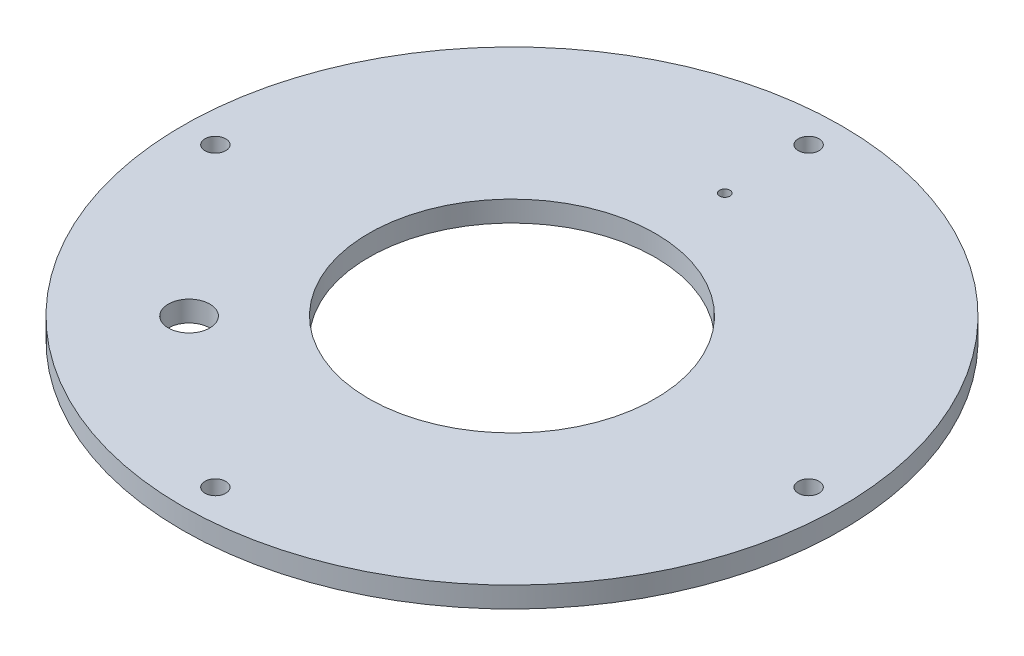
ISO-10303-21;
HEADER;
FILE_DESCRIPTION(('STEP AP214'),'2;1');
FILE_NAME('part.step','',(''),(''),'','','');
FILE_SCHEMA(('AUTOMOTIVE_DESIGN { 1 0 10303 214 1 1 1 1 }'));
ENDSEC;
DATA;
#1=APPLICATION_CONTEXT('core data for automotive mechanical design processes');
#2=APPLICATION_PROTOCOL_DEFINITION('international standard','automotive_design',2000,#1);
#3=PRODUCT_CONTEXT('',#1,'mechanical');
#4=PRODUCT('Part','Part','',(#3));
#5=PRODUCT_RELATED_PRODUCT_CATEGORY('part','',(#4));
#6=PRODUCT_DEFINITION_FORMATION('','',#4);
#7=PRODUCT_DEFINITION_CONTEXT('part definition',#1,'design');
#8=PRODUCT_DEFINITION('design','',#6,#7);
#9=PRODUCT_DEFINITION_SHAPE('','',#8);
#10=(LENGTH_UNIT() NAMED_UNIT(*) SI_UNIT(.MILLI.,.METRE.));
#11=(NAMED_UNIT(*) PLANE_ANGLE_UNIT() SI_UNIT($,.RADIAN.));
#12=(NAMED_UNIT(*) SI_UNIT($,.STERADIAN.) SOLID_ANGLE_UNIT());
#13=UNCERTAINTY_MEASURE_WITH_UNIT(LENGTH_MEASURE(1.E-05),#10,'distance_accuracy_value','');
#14=(GEOMETRIC_REPRESENTATION_CONTEXT(3) GLOBAL_UNCERTAINTY_ASSIGNED_CONTEXT((#13)) GLOBAL_UNIT_ASSIGNED_CONTEXT((#10,
#11,#12)) REPRESENTATION_CONTEXT('',''));
#15=CARTESIAN_POINT('',(0.,0.,0.));
#16=DIRECTION('',(0.,0.,1.));
#17=DIRECTION('',(1.,0.,0.));
#18=AXIS2_PLACEMENT_3D('',#15,#16,#17);
#19=CARTESIAN_POINT('',(0.,1.,0.));
#20=DIRECTION('',(0.,1.,0.));
#21=DIRECTION('',(0.,0.,1.));
#22=AXIS2_PLACEMENT_3D('',#19,#20,#21);
#23=PLANE('',#22);
#24=CARTESIAN_POINT('',(0.,1.,-10.25));
#25=DIRECTION('',(0.,1.,0.));
#26=DIRECTION('',(0.,0.,1.));
#27=AXIS2_PLACEMENT_3D('',#24,#25,#26);
#28=CIRCLE('',#27,0.25);
#29=CARTESIAN_POINT('',(0.,1.,-10.));
#30=VERTEX_POINT('',#29);
#31=EDGE_CURVE('E84',#30,#30,#28,.T.);
#32=ORIENTED_EDGE('',*,*,#31,.F.);
#33=EDGE_LOOP('',(#32));
#34=FACE_BOUND('',#33,.T.);
#35=CARTESIAN_POINT('',(-7.77817459305202,1.,7.77817459305202));
#36=DIRECTION('',(0.,1.,0.));
#37=DIRECTION('',(0.,0.,1.));
#38=AXIS2_PLACEMENT_3D('',#35,#36,#37);
#39=CIRCLE('',#38,1.);
#40=CARTESIAN_POINT('',(-7.77817459305202,1.,8.77817459305202));
#41=VERTEX_POINT('',#40);
#42=EDGE_CURVE('E87',#41,#41,#39,.T.);
#43=ORIENTED_EDGE('',*,*,#42,.F.);
#44=EDGE_LOOP('',(#43));
#45=FACE_BOUND('',#44,.T.);
#46=CARTESIAN_POINT('',(0.,1.,14.29));
#47=DIRECTION('',(0.,-1.,0.));
#48=DIRECTION('',(0.,0.,-1.));
#49=AXIS2_PLACEMENT_3D('',#46,#47,#48);
#50=CIRCLE('',#49,0.5);
#51=CARTESIAN_POINT('',(0.,1.,13.79));
#52=VERTEX_POINT('',#51);
#53=EDGE_CURVE('E75',#52,#52,#50,.T.);
#54=ORIENTED_EDGE('',*,*,#53,.T.);
#55=EDGE_LOOP('',(#54));
#56=FACE_BOUND('',#55,.T.);
#57=CARTESIAN_POINT('',(14.29,1.,0.));
#58=DIRECTION('',(0.,-1.,0.));
#59=DIRECTION('',(0.,0.,-1.));
#60=AXIS2_PLACEMENT_3D('',#57,#58,#59);
#61=CIRCLE('',#60,0.499999999999999);
#62=CARTESIAN_POINT('',(14.29,1.,-0.499999999999999));
#63=VERTEX_POINT('',#62);
#64=EDGE_CURVE('E66',#63,#63,#61,.T.);
#65=ORIENTED_EDGE('',*,*,#64,.T.);
#66=EDGE_LOOP('',(#65));
#67=FACE_BOUND('',#66,.T.);
#68=CARTESIAN_POINT('',(0.,1.,-14.29));
#69=DIRECTION('',(0.,-1.,0.));
#70=DIRECTION('',(0.,0.,-1.));
#71=AXIS2_PLACEMENT_3D('',#68,#69,#70);
#72=CIRCLE('',#71,0.5);
#73=CARTESIAN_POINT('',(0.,1.,-14.79));
#74=VERTEX_POINT('',#73);
#75=EDGE_CURVE('E57',#74,#74,#72,.T.);
#76=ORIENTED_EDGE('',*,*,#75,.T.);
#77=EDGE_LOOP('',(#76));
#78=FACE_BOUND('',#77,.T.);
#79=CARTESIAN_POINT('',(-14.29,1.,0.));
#80=DIRECTION('',(0.,-1.,0.));
#81=DIRECTION('',(0.,0.,-1.));
#82=AXIS2_PLACEMENT_3D('',#79,#80,#81);
#83=CIRCLE('',#82,0.499999999999999);
#84=CARTESIAN_POINT('',(-14.29,1.,-0.499999999999999));
#85=VERTEX_POINT('',#84);
#86=EDGE_CURVE('E46',#85,#85,#83,.T.);
#87=ORIENTED_EDGE('',*,*,#86,.T.);
#88=EDGE_LOOP('',(#87));
#89=FACE_BOUND('',#88,.T.);
#90=CARTESIAN_POINT('',(0.,1.,0.));
#91=DIRECTION('',(0.,1.,0.));
#92=DIRECTION('',(0.,0.,1.));
#93=AXIS2_PLACEMENT_3D('',#90,#91,#92);
#94=CIRCLE('',#93,15.875);
#95=CARTESIAN_POINT('',(0.,1.,15.875));
#96=VERTEX_POINT('',#95);
#97=EDGE_CURVE('E10',#96,#96,#94,.T.);
#98=ORIENTED_EDGE('',*,*,#97,.T.);
#99=EDGE_LOOP('',(#98));
#100=FACE_BOUND('',#99,.T.);
#101=CARTESIAN_POINT('',(0.,1.,0.));
#102=DIRECTION('',(0.,1.,0.));
#103=DIRECTION('',(0.,0.,1.));
#104=AXIS2_PLACEMENT_3D('',#101,#102,#103);
#105=CIRCLE('',#104,6.9);
#106=CARTESIAN_POINT('',(0.,1.,6.9));
#107=VERTEX_POINT('',#106);
#108=EDGE_CURVE('E41',#107,#107,#105,.T.);
#109=ORIENTED_EDGE('',*,*,#108,.F.);
#110=EDGE_LOOP('',(#109));
#111=FACE_BOUND('',#110,.T.);
#112=ADVANCED_FACE('F30',(#34,#45,#56,#67,#78,#89,#100,#111),#23,.T.);
#113=CARTESIAN_POINT('',(0.,0.,0.));
#114=DIRECTION('',(0.,1.,0.));
#115=DIRECTION('',(0.,0.,1.));
#116=AXIS2_PLACEMENT_3D('',#113,#114,#115);
#117=PLANE('',#116);
#118=CARTESIAN_POINT('',(0.,0.,-10.25));
#119=DIRECTION('',(0.,1.,0.));
#120=DIRECTION('',(0.,0.,1.));
#121=AXIS2_PLACEMENT_3D('',#118,#119,#120);
#122=CIRCLE('',#121,0.25);
#123=CARTESIAN_POINT('',(0.,0.,-10.));
#124=VERTEX_POINT('',#123);
#125=EDGE_CURVE('E90',#124,#124,#122,.T.);
#126=ORIENTED_EDGE('',*,*,#125,.T.);
#127=EDGE_LOOP('',(#126));
#128=FACE_BOUND('',#127,.T.);
#129=CARTESIAN_POINT('',(-7.77817459305202,0.,7.77817459305202));
#130=DIRECTION('',(0.,1.,0.));
#131=DIRECTION('',(0.,0.,1.));
#132=AXIS2_PLACEMENT_3D('',#129,#130,#131);
#133=CIRCLE('',#132,1.);
#134=CARTESIAN_POINT('',(-7.77817459305202,0.,8.77817459305202));
#135=VERTEX_POINT('',#134);
#136=EDGE_CURVE('E91',#135,#135,#133,.T.);
#137=ORIENTED_EDGE('',*,*,#136,.T.);
#138=EDGE_LOOP('',(#137));
#139=FACE_BOUND('',#138,.T.);
#140=CARTESIAN_POINT('',(0.,0.,14.29));
#141=DIRECTION('',(0.,-1.,0.));
#142=DIRECTION('',(0.,0.,-1.));
#143=AXIS2_PLACEMENT_3D('',#140,#141,#142);
#144=CIRCLE('',#143,0.8);
#145=CARTESIAN_POINT('',(0.,0.,13.49));
#146=VERTEX_POINT('',#145);
#147=EDGE_CURVE('E81',#146,#146,#144,.T.);
#148=ORIENTED_EDGE('',*,*,#147,.F.);
#149=EDGE_LOOP('',(#148));
#150=FACE_BOUND('',#149,.T.);
#151=CARTESIAN_POINT('',(14.29,0.,0.));
#152=DIRECTION('',(0.,-1.,0.));
#153=DIRECTION('',(0.,0.,-1.));
#154=AXIS2_PLACEMENT_3D('',#151,#152,#153);
#155=CIRCLE('',#154,0.8);
#156=CARTESIAN_POINT('',(14.29,0.,-0.8));
#157=VERTEX_POINT('',#156);
#158=EDGE_CURVE('E72',#157,#157,#155,.T.);
#159=ORIENTED_EDGE('',*,*,#158,.F.);
#160=EDGE_LOOP('',(#159));
#161=FACE_BOUND('',#160,.T.);
#162=CARTESIAN_POINT('',(0.,0.,-14.29));
#163=DIRECTION('',(0.,-1.,0.));
#164=DIRECTION('',(0.,0.,-1.));
#165=AXIS2_PLACEMENT_3D('',#162,#163,#164);
#166=CIRCLE('',#165,0.8);
#167=CARTESIAN_POINT('',(0.,0.,-15.09));
#168=VERTEX_POINT('',#167);
#169=EDGE_CURVE('E63',#168,#168,#166,.T.);
#170=ORIENTED_EDGE('',*,*,#169,.F.);
#171=EDGE_LOOP('',(#170));
#172=FACE_BOUND('',#171,.T.);
#173=CARTESIAN_POINT('',(-14.29,0.,0.));
#174=DIRECTION('',(0.,-1.,0.));
#175=DIRECTION('',(0.,0.,-1.));
#176=AXIS2_PLACEMENT_3D('',#173,#174,#175);
#177=CIRCLE('',#176,0.8);
#178=CARTESIAN_POINT('',(-14.29,0.,-0.8));
#179=VERTEX_POINT('',#178);
#180=EDGE_CURVE('E54',#179,#179,#177,.T.);
#181=ORIENTED_EDGE('',*,*,#180,.F.);
#182=EDGE_LOOP('',(#181));
#183=FACE_BOUND('',#182,.T.);
#184=CARTESIAN_POINT('',(0.,0.,0.));
#185=DIRECTION('',(0.,1.,0.));
#186=DIRECTION('',(0.,0.,1.));
#187=AXIS2_PLACEMENT_3D('',#184,#185,#186);
#188=CIRCLE('',#187,15.875);
#189=CARTESIAN_POINT('',(0.,0.,15.875));
#190=VERTEX_POINT('',#189);
#191=EDGE_CURVE('E34',#190,#190,#188,.T.);
#192=ORIENTED_EDGE('',*,*,#191,.F.);
#193=EDGE_LOOP('',(#192));
#194=FACE_BOUND('',#193,.T.);
#195=CARTESIAN_POINT('',(0.,0.,0.));
#196=DIRECTION('',(0.,1.,0.));
#197=DIRECTION('',(0.,0.,1.));
#198=AXIS2_PLACEMENT_3D('',#195,#196,#197);
#199=CIRCLE('',#198,6.9);
#200=CARTESIAN_POINT('',(0.,0.,6.9));
#201=VERTEX_POINT('',#200);
#202=EDGE_CURVE('E43',#201,#201,#199,.T.);
#203=ORIENTED_EDGE('',*,*,#202,.T.);
#204=EDGE_LOOP('',(#203));
#205=FACE_BOUND('',#204,.T.);
#206=ADVANCED_FACE('F97',(#128,#139,#150,#161,#172,#183,#194,#205),#117,.F.);
#207=CARTESIAN_POINT('',(0.,1.,0.));
#208=DIRECTION('',(0.,-1.,0.));
#209=DIRECTION('',(0.,0.,-1.));
#210=AXIS2_PLACEMENT_3D('',#207,#208,#209);
#211=CYLINDRICAL_SURFACE('',#210,15.875);
#212=ORIENTED_EDGE('',*,*,#97,.F.);
#213=EDGE_LOOP('',(#212));
#214=FACE_BOUND('',#213,.T.);
#215=ORIENTED_EDGE('',*,*,#191,.T.);
#216=EDGE_LOOP('',(#215));
#217=FACE_BOUND('',#216,.T.);
#218=ADVANCED_FACE('F32',(#214,#217),#211,.T.);
#219=CARTESIAN_POINT('',(0.,1.,0.));
#220=DIRECTION('',(0.,-1.,0.));
#221=DIRECTION('',(0.,0.,-1.));
#222=AXIS2_PLACEMENT_3D('',#219,#220,#221);
#223=CYLINDRICAL_SURFACE('',#222,6.9);
#224=ORIENTED_EDGE('',*,*,#108,.T.);
#225=EDGE_LOOP('',(#224));
#226=FACE_BOUND('',#225,.T.);
#227=ORIENTED_EDGE('',*,*,#202,.F.);
#228=EDGE_LOOP('',(#227));
#229=FACE_BOUND('',#228,.T.);
#230=ADVANCED_FACE('F120',(#226,#229),#223,.F.);
#231=CARTESIAN_POINT('',(-14.29,0.,0.));
#232=DIRECTION('',(0.,-1.,0.));
#233=DIRECTION('',(0.,0.,-1.));
#234=AXIS2_PLACEMENT_3D('',#231,#232,#233);
#235=CYLINDRICAL_SURFACE('',#234,0.499999999999994);
#236=ORIENTED_EDGE('',*,*,#86,.F.);
#237=EDGE_LOOP('',(#236));
#238=FACE_BOUND('',#237,.T.);
#239=CARTESIAN_POINT('',(-14.29,0.251729889353181,0.));
#240=DIRECTION('',(0.,-1.,0.));
#241=DIRECTION('',(0.,0.,-1.));
#242=AXIS2_PLACEMENT_3D('',#239,#240,#241);
#243=CIRCLE('',#242,0.499999999999988);
#244=CARTESIAN_POINT('',(-14.29,0.251729889353181,-0.499999999999988));
#245=VERTEX_POINT('',#244);
#246=EDGE_CURVE('E51',#245,#245,#243,.T.);
#247=ORIENTED_EDGE('',*,*,#246,.T.);
#248=EDGE_LOOP('',(#247));
#249=FACE_BOUND('',#248,.T.);
#250=ADVANCED_FACE('F123',(#238,#249),#235,.F.);
#251=CARTESIAN_POINT('',(-14.29,0.,0.));
#252=DIRECTION('',(0.,-1.,0.));
#253=DIRECTION('',(0.,0.,-1.));
#254=AXIS2_PLACEMENT_3D('',#251,#252,#253);
#255=CONICAL_SURFACE('',#254,0.8,0.872664625997188);
#256=ORIENTED_EDGE('',*,*,#246,.F.);
#257=EDGE_LOOP('',(#256));
#258=FACE_BOUND('',#257,.T.);
#259=ORIENTED_EDGE('',*,*,#180,.T.);
#260=EDGE_LOOP('',(#259));
#261=FACE_BOUND('',#260,.T.);
#262=ADVANCED_FACE('F127',(#258,#261),#255,.F.);
#263=CARTESIAN_POINT('',(0.,0.,-14.29));
#264=DIRECTION('',(0.,-1.,0.));
#265=DIRECTION('',(0.,0.,-1.));
#266=AXIS2_PLACEMENT_3D('',#263,#264,#265);
#267=CYLINDRICAL_SURFACE('',#266,0.499999999999994);
#268=ORIENTED_EDGE('',*,*,#75,.F.);
#269=EDGE_LOOP('',(#268));
#270=FACE_BOUND('',#269,.T.);
#271=CARTESIAN_POINT('',(0.,0.251729889353181,-14.29));
#272=DIRECTION('',(0.,-1.,0.));
#273=DIRECTION('',(0.,0.,-1.));
#274=AXIS2_PLACEMENT_3D('',#271,#272,#273);
#275=CIRCLE('',#274,0.499999999999988);
#276=CARTESIAN_POINT('',(0.,0.251729889353181,-14.79));
#277=VERTEX_POINT('',#276);
#278=EDGE_CURVE('E60',#277,#277,#275,.T.);
#279=ORIENTED_EDGE('',*,*,#278,.T.);
#280=EDGE_LOOP('',(#279));
#281=FACE_BOUND('',#280,.T.);
#282=ADVANCED_FACE('F131',(#270,#281),#267,.F.);
#283=CARTESIAN_POINT('',(0.,0.,-14.29));
#284=DIRECTION('',(0.,-1.,0.));
#285=DIRECTION('',(0.,0.,-1.));
#286=AXIS2_PLACEMENT_3D('',#283,#284,#285);
#287=CONICAL_SURFACE('',#286,0.8,0.872664625997188);
#288=ORIENTED_EDGE('',*,*,#278,.F.);
#289=EDGE_LOOP('',(#288));
#290=FACE_BOUND('',#289,.T.);
#291=ORIENTED_EDGE('',*,*,#169,.T.);
#292=EDGE_LOOP('',(#291));
#293=FACE_BOUND('',#292,.T.);
#294=ADVANCED_FACE('F135',(#290,#293),#287,.F.);
#295=CARTESIAN_POINT('',(14.29,0.,0.));
#296=DIRECTION('',(0.,-1.,0.));
#297=DIRECTION('',(0.,0.,-1.));
#298=AXIS2_PLACEMENT_3D('',#295,#296,#297);
#299=CYLINDRICAL_SURFACE('',#298,0.499999999999994);
#300=ORIENTED_EDGE('',*,*,#64,.F.);
#301=EDGE_LOOP('',(#300));
#302=FACE_BOUND('',#301,.T.);
#303=CARTESIAN_POINT('',(14.29,0.251729889353181,0.));
#304=DIRECTION('',(0.,-1.,0.));
#305=DIRECTION('',(0.,0.,-1.));
#306=AXIS2_PLACEMENT_3D('',#303,#304,#305);
#307=CIRCLE('',#306,0.499999999999988);
#308=CARTESIAN_POINT('',(14.29,0.251729889353181,-0.499999999999988));
#309=VERTEX_POINT('',#308);
#310=EDGE_CURVE('E69',#309,#309,#307,.T.);
#311=ORIENTED_EDGE('',*,*,#310,.T.);
#312=EDGE_LOOP('',(#311));
#313=FACE_BOUND('',#312,.T.);
#314=ADVANCED_FACE('F139',(#302,#313),#299,.F.);
#315=CARTESIAN_POINT('',(14.29,0.,0.));
#316=DIRECTION('',(0.,-1.,0.));
#317=DIRECTION('',(0.,0.,-1.));
#318=AXIS2_PLACEMENT_3D('',#315,#316,#317);
#319=CONICAL_SURFACE('',#318,0.8,0.872664625997188);
#320=ORIENTED_EDGE('',*,*,#310,.F.);
#321=EDGE_LOOP('',(#320));
#322=FACE_BOUND('',#321,.T.);
#323=ORIENTED_EDGE('',*,*,#158,.T.);
#324=EDGE_LOOP('',(#323));
#325=FACE_BOUND('',#324,.T.);
#326=ADVANCED_FACE('F143',(#322,#325),#319,.F.);
#327=CARTESIAN_POINT('',(0.,0.,14.29));
#328=DIRECTION('',(0.,-1.,0.));
#329=DIRECTION('',(0.,0.,-1.));
#330=AXIS2_PLACEMENT_3D('',#327,#328,#329);
#331=CYLINDRICAL_SURFACE('',#330,0.499999999999994);
#332=ORIENTED_EDGE('',*,*,#53,.F.);
#333=EDGE_LOOP('',(#332));
#334=FACE_BOUND('',#333,.T.);
#335=CARTESIAN_POINT('',(0.,0.251729889353181,14.29));
#336=DIRECTION('',(0.,-1.,0.));
#337=DIRECTION('',(0.,0.,-1.));
#338=AXIS2_PLACEMENT_3D('',#335,#336,#337);
#339=CIRCLE('',#338,0.499999999999988);
#340=CARTESIAN_POINT('',(0.,0.251729889353181,13.79));
#341=VERTEX_POINT('',#340);
#342=EDGE_CURVE('E78',#341,#341,#339,.T.);
#343=ORIENTED_EDGE('',*,*,#342,.T.);
#344=EDGE_LOOP('',(#343));
#345=FACE_BOUND('',#344,.T.);
#346=ADVANCED_FACE('F147',(#334,#345),#331,.F.);
#347=CARTESIAN_POINT('',(0.,0.,14.29));
#348=DIRECTION('',(0.,-1.,0.));
#349=DIRECTION('',(0.,0.,-1.));
#350=AXIS2_PLACEMENT_3D('',#347,#348,#349);
#351=CONICAL_SURFACE('',#350,0.8,0.872664625997188);
#352=ORIENTED_EDGE('',*,*,#342,.F.);
#353=EDGE_LOOP('',(#352));
#354=FACE_BOUND('',#353,.T.);
#355=ORIENTED_EDGE('',*,*,#147,.T.);
#356=EDGE_LOOP('',(#355));
#357=FACE_BOUND('',#356,.T.);
#358=ADVANCED_FACE('F108',(#354,#357),#351,.F.);
#359=CARTESIAN_POINT('',(-7.77817459305202,0.,7.77817459305202));
#360=DIRECTION('',(0.,1.,0.));
#361=DIRECTION('',(0.,0.,1.));
#362=AXIS2_PLACEMENT_3D('',#359,#360,#361);
#363=CYLINDRICAL_SURFACE('',#362,1.);
#364=ORIENTED_EDGE('',*,*,#42,.T.);
#365=EDGE_LOOP('',(#364));
#366=FACE_BOUND('',#365,.T.);
#367=ORIENTED_EDGE('',*,*,#136,.F.);
#368=EDGE_LOOP('',(#367));
#369=FACE_BOUND('',#368,.T.);
#370=ADVANCED_FACE('F102',(#366,#369),#363,.F.);
#371=CARTESIAN_POINT('',(0.,0.,-10.25));
#372=DIRECTION('',(0.,1.,0.));
#373=DIRECTION('',(0.,0.,1.));
#374=AXIS2_PLACEMENT_3D('',#371,#372,#373);
#375=CYLINDRICAL_SURFACE('',#374,0.25);
#376=ORIENTED_EDGE('',*,*,#31,.T.);
#377=EDGE_LOOP('',(#376));
#378=FACE_BOUND('',#377,.T.);
#379=ORIENTED_EDGE('',*,*,#125,.F.);
#380=EDGE_LOOP('',(#379));
#381=FACE_BOUND('',#380,.T.);
#382=ADVANCED_FACE('F100',(#378,#381),#375,.F.);
#383=CLOSED_SHELL('',(#112,#206,#218,#230,#250,#262,#282,#294,#314,#326,#346,#358,#370,#382));
#384=MANIFOLD_SOLID_BREP('B2',#383);
#385=ADVANCED_BREP_SHAPE_REPRESENTATION('',(#18,#384),#14);
#386=SHAPE_DEFINITION_REPRESENTATION(#9,#385);
ENDSEC;
END-ISO-10303-21;
